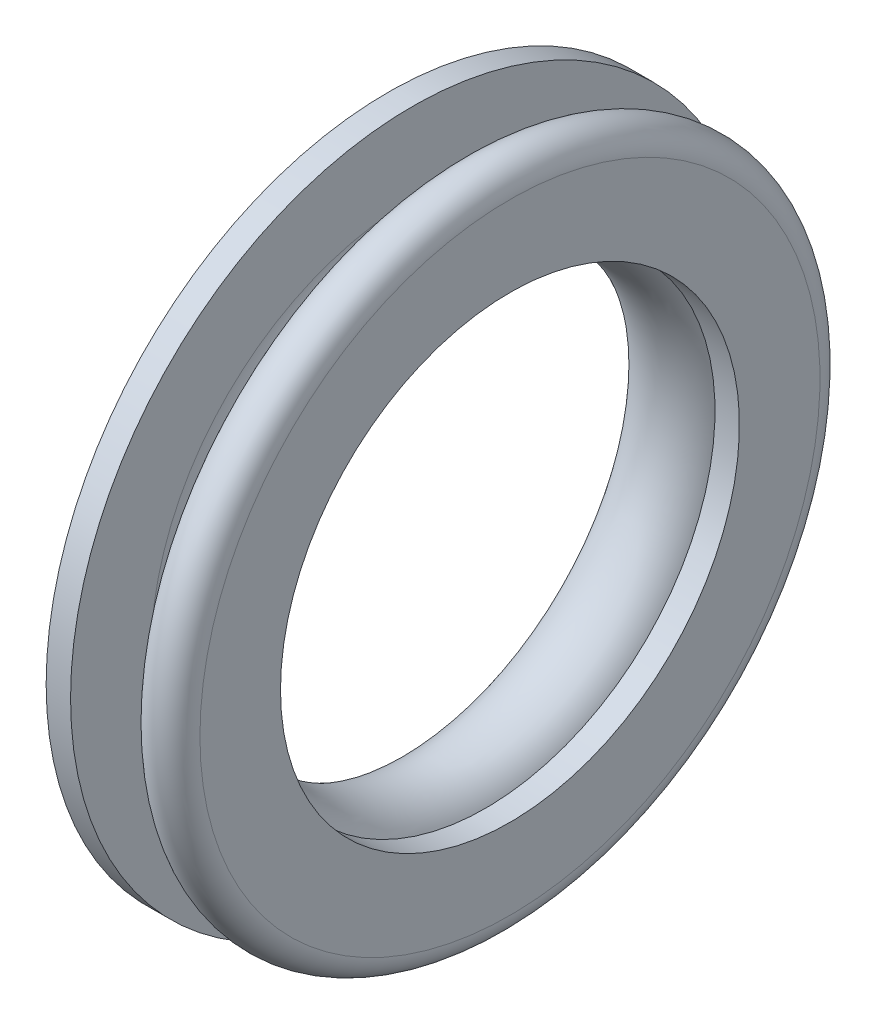
ISO-10303-21;
HEADER;
FILE_DESCRIPTION(('STEP AP214'),'2;1');
FILE_NAME('part.step','',(''),(''),'','','');
FILE_SCHEMA(('AUTOMOTIVE_DESIGN { 1 0 10303 214 1 1 1 1 }'));
ENDSEC;
DATA;
#1=APPLICATION_CONTEXT('core data for automotive mechanical design processes');
#2=APPLICATION_PROTOCOL_DEFINITION('international standard','automotive_design',2000,#1);
#3=PRODUCT_CONTEXT('',#1,'mechanical');
#4=PRODUCT('Part','Part','',(#3));
#5=PRODUCT_RELATED_PRODUCT_CATEGORY('part','',(#4));
#6=PRODUCT_DEFINITION_FORMATION('','',#4);
#7=PRODUCT_DEFINITION_CONTEXT('part definition',#1,'design');
#8=PRODUCT_DEFINITION('design','',#6,#7);
#9=PRODUCT_DEFINITION_SHAPE('','',#8);
#10=(LENGTH_UNIT() NAMED_UNIT(*) SI_UNIT(.MILLI.,.METRE.));
#11=(NAMED_UNIT(*) PLANE_ANGLE_UNIT() SI_UNIT($,.RADIAN.));
#12=(NAMED_UNIT(*) SI_UNIT($,.STERADIAN.) SOLID_ANGLE_UNIT());
#13=UNCERTAINTY_MEASURE_WITH_UNIT(LENGTH_MEASURE(1.E-05),#10,'distance_accuracy_value','');
#14=(GEOMETRIC_REPRESENTATION_CONTEXT(3) GLOBAL_UNCERTAINTY_ASSIGNED_CONTEXT((#13)) GLOBAL_UNIT_ASSIGNED_CONTEXT((#10,
#11,#12)) REPRESENTATION_CONTEXT('',''));
#15=CARTESIAN_POINT('',(0.,0.,0.));
#16=DIRECTION('',(0.,0.,1.));
#17=DIRECTION('',(1.,0.,0.));
#18=AXIS2_PLACEMENT_3D('',#15,#16,#17);
#19=CARTESIAN_POINT('',(0.,0.,0.));
#20=DIRECTION('',(-1.,0.,0.));
#21=DIRECTION('',(0.,0.,1.));
#22=AXIS2_PLACEMENT_3D('',#19,#20,#21);
#23=CYLINDRICAL_SURFACE('',#22,7.);
#24=CARTESIAN_POINT('',(0.,0.,0.));
#25=DIRECTION('',(-1.,0.,0.));
#26=DIRECTION('',(0.,0.,1.));
#27=AXIS2_PLACEMENT_3D('',#24,#25,#26);
#28=CIRCLE('',#27,7.);
#29=CARTESIAN_POINT('',(0.,0.,7.));
#30=VERTEX_POINT('',#29);
#31=EDGE_CURVE('E10',#30,#30,#28,.T.);
#32=ORIENTED_EDGE('',*,*,#31,.F.);
#33=EDGE_LOOP('',(#32));
#34=FACE_BOUND('',#33,.T.);
#35=CARTESIAN_POINT('',(0.5,0.,0.));
#36=DIRECTION('',(-1.,0.,0.));
#37=DIRECTION('',(0.,0.,1.));
#38=AXIS2_PLACEMENT_3D('',#35,#36,#37);
#39=CIRCLE('',#38,7.);
#40=CARTESIAN_POINT('',(0.5,0.,7.));
#41=VERTEX_POINT('',#40);
#42=EDGE_CURVE('E66',#41,#41,#39,.T.);
#43=ORIENTED_EDGE('',*,*,#42,.T.);
#44=EDGE_LOOP('',(#43));
#45=FACE_BOUND('',#44,.T.);
#46=ADVANCED_FACE('F32',(#34,#45),#23,.T.);
#47=CARTESIAN_POINT('',(0.,7.,0.));
#48=DIRECTION('',(1.,0.,0.));
#49=DIRECTION('',(0.,0.,-1.));
#50=AXIS2_PLACEMENT_3D('',#47,#48,#49);
#51=PLANE('',#50);
#52=CARTESIAN_POINT('',(0.,0.,0.));
#53=DIRECTION('',(-1.,0.,0.));
#54=DIRECTION('',(0.,0.,1.));
#55=AXIS2_PLACEMENT_3D('',#52,#53,#54);
#56=CIRCLE('',#55,5.35);
#57=CARTESIAN_POINT('',(0.,0.,5.35));
#58=VERTEX_POINT('',#57);
#59=EDGE_CURVE('E38',#58,#58,#56,.T.);
#60=ORIENTED_EDGE('',*,*,#59,.F.);
#61=EDGE_LOOP('',(#60));
#62=FACE_BOUND('',#61,.T.);
#63=ORIENTED_EDGE('',*,*,#31,.T.);
#64=EDGE_LOOP('',(#63));
#65=FACE_BOUND('',#64,.T.);
#66=ADVANCED_FACE('F115',(#62,#65),#51,.F.);
#67=CARTESIAN_POINT('',(1.,0.,0.));
#68=DIRECTION('',(-1.,0.,0.));
#69=DIRECTION('',(0.,0.,1.));
#70=AXIS2_PLACEMENT_3D('',#67,#68,#69);
#71=TOROIDAL_SURFACE('',#70,5.35,1.);
#72=CARTESIAN_POINT('',(2.,0.,0.));
#73=DIRECTION('',(-1.,0.,0.));
#74=DIRECTION('',(0.,0.,1.));
#75=AXIS2_PLACEMENT_3D('',#72,#73,#74);
#76=CIRCLE('',#75,5.35);
#77=CARTESIAN_POINT('',(2.,0.,5.35));
#78=VERTEX_POINT('',#77);
#79=EDGE_CURVE('E42',#78,#78,#76,.T.);
#80=ORIENTED_EDGE('',*,*,#79,.F.);
#81=EDGE_LOOP('',(#80));
#82=FACE_BOUND('',#81,.T.);
#83=ORIENTED_EDGE('',*,*,#59,.T.);
#84=EDGE_LOOP('',(#83));
#85=FACE_BOUND('',#84,.T.);
#86=ADVANCED_FACE('F110',(#82,#85),#71,.T.);
#87=CARTESIAN_POINT('',(2.,4.7,0.));
#88=DIRECTION('',(1.,0.,0.));
#89=DIRECTION('',(0.,0.,-1.));
#90=AXIS2_PLACEMENT_3D('',#87,#88,#89);
#91=PLANE('',#90);
#92=CARTESIAN_POINT('',(2.,0.,0.));
#93=DIRECTION('',(-1.,0.,0.));
#94=DIRECTION('',(0.,0.,1.));
#95=AXIS2_PLACEMENT_3D('',#92,#93,#94);
#96=CIRCLE('',#95,4.7);
#97=CARTESIAN_POINT('',(2.,0.,4.7));
#98=VERTEX_POINT('',#97);
#99=EDGE_CURVE('E46',#98,#98,#96,.T.);
#100=ORIENTED_EDGE('',*,*,#99,.F.);
#101=EDGE_LOOP('',(#100));
#102=FACE_BOUND('',#101,.T.);
#103=ORIENTED_EDGE('',*,*,#79,.T.);
#104=EDGE_LOOP('',(#103));
#105=FACE_BOUND('',#104,.T.);
#106=ADVANCED_FACE('F104',(#102,#105),#91,.F.);
#107=CARTESIAN_POINT('',(0.,0.,0.));
#108=DIRECTION('',(-1.,0.,0.));
#109=DIRECTION('',(0.,0.,1.));
#110=AXIS2_PLACEMENT_3D('',#107,#108,#109);
#111=CYLINDRICAL_SURFACE('',#110,4.7);
#112=CARTESIAN_POINT('',(2.5,0.,0.));
#113=DIRECTION('',(-1.,0.,0.));
#114=DIRECTION('',(0.,0.,1.));
#115=AXIS2_PLACEMENT_3D('',#112,#113,#114);
#116=CIRCLE('',#115,4.7);
#117=CARTESIAN_POINT('',(2.5,0.,4.7));
#118=VERTEX_POINT('',#117);
#119=EDGE_CURVE('E51',#118,#118,#116,.T.);
#120=ORIENTED_EDGE('',*,*,#119,.F.);
#121=EDGE_LOOP('',(#120));
#122=FACE_BOUND('',#121,.T.);
#123=ORIENTED_EDGE('',*,*,#99,.T.);
#124=EDGE_LOOP('',(#123));
#125=FACE_BOUND('',#124,.T.);
#126=ADVANCED_FACE('F98',(#122,#125),#111,.F.);
#127=CARTESIAN_POINT('',(2.5,6.35,0.));
#128=DIRECTION('',(-1.,0.,0.));
#129=DIRECTION('',(0.,0.,1.));
#130=AXIS2_PLACEMENT_3D('',#127,#128,#129);
#131=PLANE('',#130);
#132=CARTESIAN_POINT('',(2.5,0.,0.));
#133=DIRECTION('',(-1.,0.,0.));
#134=DIRECTION('',(0.,0.,1.));
#135=AXIS2_PLACEMENT_3D('',#132,#133,#134);
#136=CIRCLE('',#135,6.35);
#137=CARTESIAN_POINT('',(2.5,0.,6.35));
#138=VERTEX_POINT('',#137);
#139=EDGE_CURVE('E54',#138,#138,#136,.T.);
#140=ORIENTED_EDGE('',*,*,#139,.F.);
#141=EDGE_LOOP('',(#140));
#142=FACE_BOUND('',#141,.T.);
#143=ORIENTED_EDGE('',*,*,#119,.T.);
#144=EDGE_LOOP('',(#143));
#145=FACE_BOUND('',#144,.T.);
#146=ADVANCED_FACE('F92',(#142,#145),#131,.F.);
#147=CARTESIAN_POINT('',(2.,0.,0.));
#148=DIRECTION('',(-1.,0.,0.));
#149=DIRECTION('',(0.,0.,1.));
#150=AXIS2_PLACEMENT_3D('',#147,#148,#149);
#151=TOROIDAL_SURFACE('',#150,6.35,0.5);
#152=CARTESIAN_POINT('',(1.5,0.,0.));
#153=DIRECTION('',(-1.,0.,0.));
#154=DIRECTION('',(0.,0.,1.));
#155=AXIS2_PLACEMENT_3D('',#152,#153,#154);
#156=CIRCLE('',#155,6.35);
#157=CARTESIAN_POINT('',(1.5,0.,6.35));
#158=VERTEX_POINT('',#157);
#159=EDGE_CURVE('E57',#158,#158,#156,.T.);
#160=ORIENTED_EDGE('',*,*,#159,.F.);
#161=EDGE_LOOP('',(#160));
#162=FACE_BOUND('',#161,.T.);
#163=ORIENTED_EDGE('',*,*,#139,.T.);
#164=EDGE_LOOP('',(#163));
#165=FACE_BOUND('',#164,.T.);
#166=ADVANCED_FACE('F86',(#162,#165),#151,.T.);
#167=CARTESIAN_POINT('',(1.5,5.35,0.));
#168=DIRECTION('',(1.,0.,0.));
#169=DIRECTION('',(0.,0.,-1.));
#170=AXIS2_PLACEMENT_3D('',#167,#168,#169);
#171=PLANE('',#170);
#172=CARTESIAN_POINT('',(1.5,0.,0.));
#173=DIRECTION('',(-1.,0.,0.));
#174=DIRECTION('',(0.,0.,1.));
#175=AXIS2_PLACEMENT_3D('',#172,#173,#174);
#176=CIRCLE('',#175,5.35);
#177=CARTESIAN_POINT('',(1.5,0.,5.35));
#178=VERTEX_POINT('',#177);
#179=EDGE_CURVE('E60',#178,#178,#176,.T.);
#180=ORIENTED_EDGE('',*,*,#179,.F.);
#181=EDGE_LOOP('',(#180));
#182=FACE_BOUND('',#181,.T.);
#183=ORIENTED_EDGE('',*,*,#159,.T.);
#184=EDGE_LOOP('',(#183));
#185=FACE_BOUND('',#184,.T.);
#186=ADVANCED_FACE('F80',(#182,#185),#171,.F.);
#187=CARTESIAN_POINT('',(1.,0.,0.));
#188=DIRECTION('',(-1.,0.,0.));
#189=DIRECTION('',(0.,0.,1.));
#190=AXIS2_PLACEMENT_3D('',#187,#188,#189);
#191=TOROIDAL_SURFACE('',#190,5.35,0.5);
#192=CARTESIAN_POINT('',(0.5,0.,0.));
#193=DIRECTION('',(-1.,0.,0.));
#194=DIRECTION('',(0.,0.,1.));
#195=AXIS2_PLACEMENT_3D('',#192,#193,#194);
#196=CIRCLE('',#195,5.35);
#197=CARTESIAN_POINT('',(0.5,0.,5.35));
#198=VERTEX_POINT('',#197);
#199=EDGE_CURVE('E63',#198,#198,#196,.T.);
#200=ORIENTED_EDGE('',*,*,#199,.F.);
#201=EDGE_LOOP('',(#200));
#202=FACE_BOUND('',#201,.T.);
#203=ORIENTED_EDGE('',*,*,#179,.T.);
#204=EDGE_LOOP('',(#203));
#205=FACE_BOUND('',#204,.T.);
#206=ADVANCED_FACE('F74',(#202,#205),#191,.F.);
#207=CARTESIAN_POINT('',(0.5,7.,0.));
#208=DIRECTION('',(-1.,0.,0.));
#209=DIRECTION('',(0.,0.,1.));
#210=AXIS2_PLACEMENT_3D('',#207,#208,#209);
#211=PLANE('',#210);
#212=ORIENTED_EDGE('',*,*,#42,.F.);
#213=EDGE_LOOP('',(#212));
#214=FACE_BOUND('',#213,.T.);
#215=ORIENTED_EDGE('',*,*,#199,.T.);
#216=EDGE_LOOP('',(#215));
#217=FACE_BOUND('',#216,.T.);
#218=ADVANCED_FACE('F71',(#214,#217),#211,.F.);
#219=CLOSED_SHELL('',(#46,#66,#86,#106,#126,#146,#166,#186,#206,#218));
#220=MANIFOLD_SOLID_BREP('B2',#219);
#221=ADVANCED_BREP_SHAPE_REPRESENTATION('',(#18,#220),#14);
#222=SHAPE_DEFINITION_REPRESENTATION(#9,#221);
ENDSEC;
END-ISO-10303-21;
